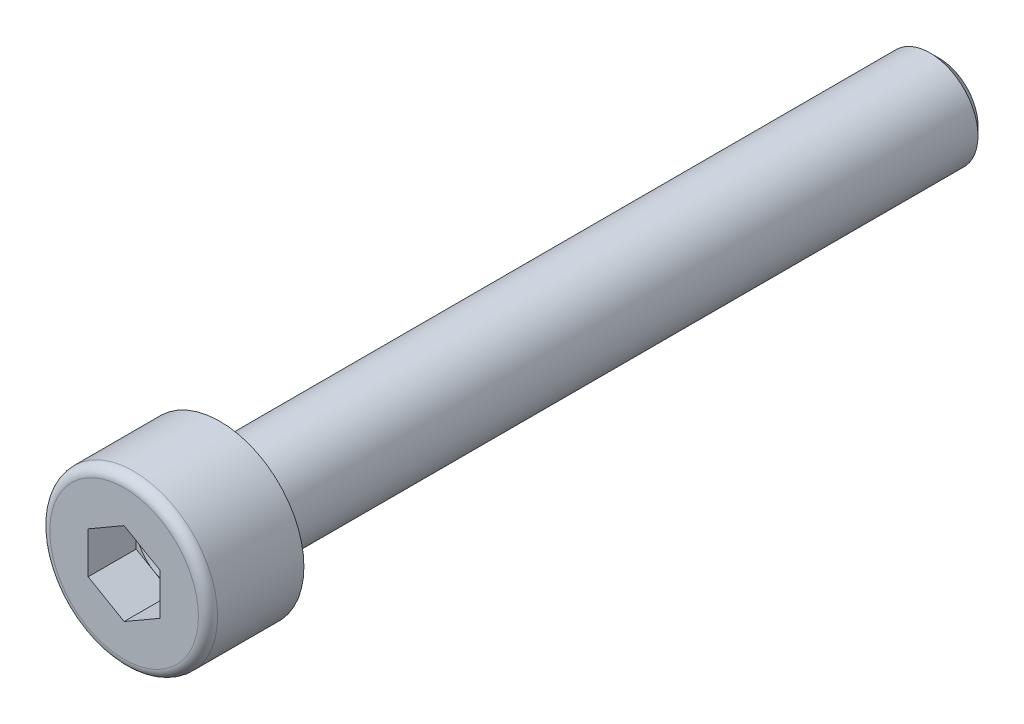
ISO-10303-21;
HEADER;
FILE_DESCRIPTION(('STEP AP214'),'2;1');
FILE_NAME('part.step','',(''),(''),'','','');
FILE_SCHEMA(('AUTOMOTIVE_DESIGN { 1 0 10303 214 1 1 1 1 }'));
ENDSEC;
DATA;
#1=APPLICATION_CONTEXT('core data for automotive mechanical design processes');
#2=APPLICATION_PROTOCOL_DEFINITION('international standard','automotive_design',2000,#1);
#3=PRODUCT_CONTEXT('',#1,'mechanical');
#4=PRODUCT('Part','Part','',(#3));
#5=PRODUCT_RELATED_PRODUCT_CATEGORY('part','',(#4));
#6=PRODUCT_DEFINITION_FORMATION('','',#4);
#7=PRODUCT_DEFINITION_CONTEXT('part definition',#1,'design');
#8=PRODUCT_DEFINITION('design','',#6,#7);
#9=PRODUCT_DEFINITION_SHAPE('','',#8);
#10=(LENGTH_UNIT() NAMED_UNIT(*) SI_UNIT(.MILLI.,.METRE.));
#11=(NAMED_UNIT(*) PLANE_ANGLE_UNIT() SI_UNIT($,.RADIAN.));
#12=(NAMED_UNIT(*) SI_UNIT($,.STERADIAN.) SOLID_ANGLE_UNIT());
#13=UNCERTAINTY_MEASURE_WITH_UNIT(LENGTH_MEASURE(1.E-05),#10,'distance_accuracy_value','');
#14=(GEOMETRIC_REPRESENTATION_CONTEXT(3) GLOBAL_UNCERTAINTY_ASSIGNED_CONTEXT((#13)) GLOBAL_UNIT_ASSIGNED_CONTEXT((#10,
#11,#12)) REPRESENTATION_CONTEXT('',''));
#15=CARTESIAN_POINT('',(0.,0.,0.));
#16=DIRECTION('',(0.,0.,1.));
#17=DIRECTION('',(1.,0.,0.));
#18=AXIS2_PLACEMENT_3D('',#15,#16,#17);
#19=CARTESIAN_POINT('',(0.,0.,-33.6211138875));
#20=DIRECTION('',(0.,0.,1.));
#21=DIRECTION('',(1.,0.,0.));
#22=AXIS2_PLACEMENT_3D('',#19,#20,#21);
#23=CONICAL_SURFACE('',#22,2.,0.785398163397452);
#24=CARTESIAN_POINT('',(0.,0.,-33.6211138875));
#25=DIRECTION('',(0.,0.,1.));
#26=DIRECTION('',(1.,0.,0.));
#27=AXIS2_PLACEMENT_3D('',#24,#25,#26);
#28=CIRCLE('',#27,2.);
#29=CARTESIAN_POINT('',(2.,0.,-33.6211138875));
#30=VERTEX_POINT('',#29);
#31=EDGE_CURVE('E276',#30,#30,#28,.T.);
#32=ORIENTED_EDGE('',*,*,#31,.F.);
#33=EDGE_LOOP('',(#32));
#34=FACE_BOUND('',#33,.T.);
#35=CARTESIAN_POINT('',(0.,0.,-34.));
#36=DIRECTION('',(0.,0.,-1.));
#37=DIRECTION('',(1.,0.,0.));
#38=AXIS2_PLACEMENT_3D('',#35,#36,#37);
#39=CIRCLE('',#38,1.62111388749999);
#40=CARTESIAN_POINT('',(1.62111388749999,0.,-34.));
#41=VERTEX_POINT('',#40);
#42=EDGE_CURVE('E282',#41,#41,#39,.T.);
#43=ORIENTED_EDGE('',*,*,#42,.F.);
#44=EDGE_LOOP('',(#43));
#45=FACE_BOUND('',#44,.T.);
#46=ADVANCED_FACE('F17',(#34,#45),#23,.T.);
#47=CARTESIAN_POINT('',(0.,0.,-4.2));
#48=DIRECTION('',(0.,0.,1.));
#49=DIRECTION('',(1.,0.,0.));
#50=AXIS2_PLACEMENT_3D('',#47,#48,#49);
#51=TOROIDAL_SURFACE('',#50,2.46487406649082,0.2);
#52=CARTESIAN_POINT('',(0.,0.,-4.));
#53=DIRECTION('',(0.,0.,1.));
#54=DIRECTION('',(1.,0.,0.));
#55=AXIS2_PLACEMENT_3D('',#52,#53,#54);
#56=CIRCLE('',#55,2.46487406649082);
#57=CARTESIAN_POINT('',(2.46487406649082,0.,-4.));
#58=VERTEX_POINT('',#57);
#59=EDGE_CURVE('E273',#58,#58,#56,.T.);
#60=ORIENTED_EDGE('',*,*,#59,.F.);
#61=EDGE_LOOP('',(#60));
#62=FACE_BOUND('',#61,.T.);
#63=CARTESIAN_POINT('',(0.,0.,-4.09922579489519));
#64=DIRECTION('',(0.,0.,-1.));
#65=DIRECTION('',(1.,0.,0.));
#66=AXIS2_PLACEMENT_3D('',#63,#64,#65);
#67=CIRCLE('',#66,2.29211828631114);
#68=CARTESIAN_POINT('',(2.29211828631114,0.,-4.09922579489519));
#69=VERTEX_POINT('',#68);
#70=EDGE_CURVE('E11',#69,#69,#67,.T.);
#71=ORIENTED_EDGE('',*,*,#70,.F.);
#72=EDGE_LOOP('',(#71));
#73=FACE_BOUND('',#72,.T.);
#74=ADVANCED_FACE('F615',(#62,#73),#51,.F.);
#75=CARTESIAN_POINT('',(0.,0.,-4.65406982827));
#76=DIRECTION('',(0.,0.,-1.));
#77=DIRECTION('',(-1.,0.,0.));
#78=AXIS2_PLACEMENT_3D('',#75,#76,#77);
#79=TOROIDAL_SURFACE('',#78,2.2,0.2);
#80=CARTESIAN_POINT('',(0.,0.,-4.65406982827));
#81=DIRECTION('',(0.,0.,-1.));
#82=DIRECTION('',(-1.,0.,0.));
#83=AXIS2_PLACEMENT_3D('',#80,#81,#82);
#84=CIRCLE('',#83,2.);
#85=CARTESIAN_POINT('',(-2.,0.,-4.65406982827));
#86=VERTEX_POINT('',#85);
#87=EDGE_CURVE('E279',#86,#86,#84,.T.);
#88=ORIENTED_EDGE('',*,*,#87,.F.);
#89=EDGE_LOOP('',(#88));
#90=FACE_BOUND('',#89,.T.);
#91=CARTESIAN_POINT('',(0.,0.,-4.55329562316518));
#92=DIRECTION('',(0.,0.,1.));
#93=DIRECTION('',(1.,0.,0.));
#94=AXIS2_PLACEMENT_3D('',#91,#92,#93);
#95=CIRCLE('',#94,2.02724421982031);
#96=CARTESIAN_POINT('',(2.02724421982031,0.,-4.55329562316518));
#97=VERTEX_POINT('',#96);
#98=EDGE_CURVE('E25',#97,#97,#95,.T.);
#99=ORIENTED_EDGE('',*,*,#98,.F.);
#100=EDGE_LOOP('',(#99));
#101=FACE_BOUND('',#100,.T.);
#102=ADVANCED_FACE('F606',(#90,#101),#79,.F.);
#103=CARTESIAN_POINT('',(0.,0.,-4.));
#104=DIRECTION('',(0.,0.,1.));
#105=DIRECTION('',(1.,0.,0.));
#106=AXIS2_PLACEMENT_3D('',#103,#104,#105);
#107=CONICAL_SURFACE('',#106,2.35,0.528074448426359);
#108=ORIENTED_EDGE('',*,*,#70,.T.);
#109=EDGE_LOOP('',(#108));
#110=FACE_BOUND('',#109,.T.);
#111=ORIENTED_EDGE('',*,*,#98,.T.);
#112=EDGE_LOOP('',(#111));
#113=FACE_BOUND('',#112,.T.);
#114=ADVANCED_FACE('F597',(#110,#113),#107,.T.);
#115=CARTESIAN_POINT('',(0.,0.,-2.));
#116=DIRECTION('',(0.,0.,1.));
#117=DIRECTION('',(1.,0.,0.));
#118=AXIS2_PLACEMENT_3D('',#115,#116,#117);
#119=CONICAL_SURFACE('',#118,1.5,1.22173047639603);
#120=CARTESIAN_POINT('',(0.,0.,-2.));
#121=DIRECTION('',(0.,0.,-1.));
#122=DIRECTION('',(-1.,0.,0.));
#123=AXIS2_PLACEMENT_3D('',#120,#121,#122);
#124=CIRCLE('',#123,1.5);
#125=CARTESIAN_POINT('',(-1.5,0.,-2.));
#126=VERTEX_POINT('',#125);
#127=CARTESIAN_POINT('',(-0.75,1.29903810567666,-2.));
#128=VERTEX_POINT('',#127);
#129=EDGE_CURVE('E169',#126,#128,#124,.T.);
#130=ORIENTED_EDGE('',*,*,#129,.F.);
#131=CARTESIAN_POINT('',(0.,0.,-2.));
#132=DIRECTION('',(0.,0.,-1.));
#133=DIRECTION('',(-1.,0.,0.));
#134=AXIS2_PLACEMENT_3D('',#131,#132,#133);
#135=CIRCLE('',#134,1.5);
#136=CARTESIAN_POINT('',(-0.75,-1.29903810567666,-2.));
#137=VERTEX_POINT('',#136);
#138=EDGE_CURVE('E147',#137,#126,#135,.T.);
#139=ORIENTED_EDGE('',*,*,#138,.F.);
#140=CARTESIAN_POINT('',(0.,0.,-2.));
#141=DIRECTION('',(0.,0.,-1.));
#142=DIRECTION('',(-1.,0.,0.));
#143=AXIS2_PLACEMENT_3D('',#140,#141,#142);
#144=CIRCLE('',#143,1.5);
#145=CARTESIAN_POINT('',(0.75,-1.29903810567666,-2.));
#146=VERTEX_POINT('',#145);
#147=EDGE_CURVE('E232',#146,#137,#144,.T.);
#148=ORIENTED_EDGE('',*,*,#147,.F.);
#149=CARTESIAN_POINT('',(0.,0.,-2.));
#150=DIRECTION('',(0.,0.,-1.));
#151=DIRECTION('',(-1.,0.,0.));
#152=AXIS2_PLACEMENT_3D('',#149,#150,#151);
#153=CIRCLE('',#152,1.5);
#154=CARTESIAN_POINT('',(1.5,0.,-2.));
#155=VERTEX_POINT('',#154);
#156=EDGE_CURVE('E227',#155,#146,#153,.T.);
#157=ORIENTED_EDGE('',*,*,#156,.F.);
#158=CARTESIAN_POINT('',(0.,0.,-2.));
#159=DIRECTION('',(0.,0.,-1.));
#160=DIRECTION('',(-1.,0.,0.));
#161=AXIS2_PLACEMENT_3D('',#158,#159,#160);
#162=CIRCLE('',#161,1.5);
#163=CARTESIAN_POINT('',(0.75,1.29903810567666,-2.));
#164=VERTEX_POINT('',#163);
#165=EDGE_CURVE('E201',#164,#155,#162,.T.);
#166=ORIENTED_EDGE('',*,*,#165,.F.);
#167=CARTESIAN_POINT('',(0.,0.,-2.));
#168=DIRECTION('',(0.,0.,-1.));
#169=DIRECTION('',(-1.,0.,0.));
#170=AXIS2_PLACEMENT_3D('',#167,#168,#169);
#171=CIRCLE('',#170,1.5);
#172=EDGE_CURVE('E173',#128,#164,#171,.T.);
#173=ORIENTED_EDGE('',*,*,#172,.F.);
#174=EDGE_LOOP('',(#130,#139,#148,#157,#166,#173));
#175=FACE_BOUND('',#174,.T.);
#176=CARTESIAN_POINT('',(0.,0.,-2.5459553513993));
#177=VERTEX_POINT('',#176);
#178=VERTEX_LOOP('',#177);
#179=FACE_BOUND('',#178,.T.);
#180=ADVANCED_FACE('F170',(#175,#179),#119,.F.);
#181=CARTESIAN_POINT('',(0.,0.,-2.));
#182=DIRECTION('',(0.,0.,1.));
#183=DIRECTION('',(1.,0.,0.));
#184=AXIS2_PLACEMENT_3D('',#181,#182,#183);
#185=PLANE('',#184);
#186=DIRECTION('',(-0.866025403784439,0.5,0.));
#187=VECTOR('',#186,1.);
#188=CARTESIAN_POINT('',(-0.75,-1.29903810567666,-2.));
#189=LINE('',#188,#187);
#190=CARTESIAN_POINT('',(-1.5,-0.866025403784439,-2.));
#191=VERTEX_POINT('',#190);
#192=EDGE_CURVE('E152',#137,#191,#189,.T.);
#193=ORIENTED_EDGE('',*,*,#192,.F.);
#194=ORIENTED_EDGE('',*,*,#138,.T.);
#195=DIRECTION('',(0.,1.,0.));
#196=VECTOR('',#195,1.);
#197=CARTESIAN_POINT('',(-1.5,0.,-2.));
#198=LINE('',#197,#196);
#199=EDGE_CURVE('E150',#191,#126,#198,.T.);
#200=ORIENTED_EDGE('',*,*,#199,.F.);
#201=EDGE_LOOP('',(#193,#194,#200));
#202=FACE_BOUND('',#201,.T.);
#203=ADVANCED_FACE('F149',(#202),#185,.T.);
#204=CARTESIAN_POINT('',(0.721250214161918,-1.31563680226942,-2.));
#205=DIRECTION('',(-0.5,0.866025403784439,0.));
#206=DIRECTION('',(0.,0.,1.));
#207=AXIS2_PLACEMENT_3D('',#204,#205,#206);
#208=PLANE('',#207);
#209=DIRECTION('',(-0.866025403784439,-0.5,0.));
#210=VECTOR('',#209,1.);
#211=CARTESIAN_POINT('',(0.721250214161918,-1.31563680226942,0.));
#212=LINE('',#211,#210);
#213=CARTESIAN_POINT('',(1.5,-0.866025403784439,0.));
#214=VERTEX_POINT('',#213);
#215=CARTESIAN_POINT('',(0.,-1.73205080756888,0.));
#216=VERTEX_POINT('',#215);
#217=EDGE_CURVE('E216',#214,#216,#212,.T.);
#218=ORIENTED_EDGE('',*,*,#217,.F.);
#219=DIRECTION('',(0.,0.,1.));
#220=VECTOR('',#219,1.);
#221=CARTESIAN_POINT('',(1.5,-0.866025403784439,-2.));
#222=LINE('',#221,#220);
#223=CARTESIAN_POINT('',(1.5,-0.866025403784439,-2.));
#224=VERTEX_POINT('',#223);
#225=EDGE_CURVE('E195',#224,#214,#222,.T.);
#226=ORIENTED_EDGE('',*,*,#225,.F.);
#227=DIRECTION('',(-0.866025403784439,-0.5,0.));
#228=VECTOR('',#227,1.);
#229=CARTESIAN_POINT('',(0.721250214161918,-1.31563680226942,-2.));
#230=LINE('',#229,#228);
#231=EDGE_CURVE('E231',#224,#146,#230,.T.);
#232=ORIENTED_EDGE('',*,*,#231,.T.);
#233=DIRECTION('',(-0.866025403784439,-0.5,0.));
#234=VECTOR('',#233,1.);
#235=CARTESIAN_POINT('',(0.721250214161918,-1.31563680226942,-2.));
#236=LINE('',#235,#234);
#237=CARTESIAN_POINT('',(0.,-1.73205080756888,-2.));
#238=VERTEX_POINT('',#237);
#239=EDGE_CURVE('E237',#146,#238,#236,.T.);
#240=ORIENTED_EDGE('',*,*,#239,.T.);
#241=DIRECTION('',(0.,0.,1.));
#242=VECTOR('',#241,1.);
#243=CARTESIAN_POINT('',(0.,-1.73205080756888,-2.));
#244=LINE('',#243,#242);
#245=EDGE_CURVE('E166',#238,#216,#244,.T.);
#246=ORIENTED_EDGE('',*,*,#245,.T.);
#247=EDGE_LOOP('',(#218,#226,#232,#240,#246));
#248=FACE_BOUND('',#247,.T.);
#249=ADVANCED_FACE('F572',(#248),#208,.T.);
#250=CARTESIAN_POINT('',(-0.75,-1.29903810567666,-2.));
#251=DIRECTION('',(0.5,0.866025403784439,0.));
#252=DIRECTION('',(0.,0.,-1.));
#253=AXIS2_PLACEMENT_3D('',#250,#251,#252);
#254=PLANE('',#253);
#255=DIRECTION('',(-0.866025403784439,0.5,0.));
#256=VECTOR('',#255,1.);
#257=CARTESIAN_POINT('',(-0.75,-1.29903810567666,0.));
#258=LINE('',#257,#256);
#259=CARTESIAN_POINT('',(-1.5,-0.866025403784439,0.));
#260=VERTEX_POINT('',#259);
#261=EDGE_CURVE('E244',#216,#260,#258,.T.);
#262=ORIENTED_EDGE('',*,*,#261,.F.);
#263=ORIENTED_EDGE('',*,*,#245,.F.);
#264=DIRECTION('',(-0.866025403784439,0.5,0.));
#265=VECTOR('',#264,1.);
#266=CARTESIAN_POINT('',(-0.75,-1.29903810567666,-2.));
#267=LINE('',#266,#265);
#268=EDGE_CURVE('E236',#238,#137,#267,.T.);
#269=ORIENTED_EDGE('',*,*,#268,.T.);
#270=ORIENTED_EDGE('',*,*,#192,.T.);
#271=DIRECTION('',(0.,0.,1.));
#272=VECTOR('',#271,1.);
#273=CARTESIAN_POINT('',(-1.5,-0.866025403784439,-2.));
#274=LINE('',#273,#272);
#275=EDGE_CURVE('E164',#191,#260,#274,.T.);
#276=ORIENTED_EDGE('',*,*,#275,.T.);
#277=EDGE_LOOP('',(#262,#263,#269,#270,#276));
#278=FACE_BOUND('',#277,.T.);
#279=ADVANCED_FACE('F563',(#278),#254,.T.);
#280=CARTESIAN_POINT('',(-1.5,0.,-2.));
#281=DIRECTION('',(1.,0.,0.));
#282=DIRECTION('',(0.,-1.,0.));
#283=AXIS2_PLACEMENT_3D('',#280,#281,#282);
#284=PLANE('',#283);
#285=DIRECTION('',(0.,1.,0.));
#286=VECTOR('',#285,1.);
#287=CARTESIAN_POINT('',(-1.5,0.,0.));
#288=LINE('',#287,#286);
#289=CARTESIAN_POINT('',(-1.5,0.866025403784439,0.));
#290=VERTEX_POINT('',#289);
#291=EDGE_CURVE('E248',#260,#290,#288,.T.);
#292=ORIENTED_EDGE('',*,*,#291,.F.);
#293=ORIENTED_EDGE('',*,*,#275,.F.);
#294=ORIENTED_EDGE('',*,*,#199,.T.);
#295=DIRECTION('',(0.,1.,0.));
#296=VECTOR('',#295,1.);
#297=CARTESIAN_POINT('',(-1.5,0.,-2.));
#298=LINE('',#297,#296);
#299=CARTESIAN_POINT('',(-1.5,0.866025403784439,-2.));
#300=VERTEX_POINT('',#299);
#301=EDGE_CURVE('E163',#126,#300,#298,.T.);
#302=ORIENTED_EDGE('',*,*,#301,.T.);
#303=DIRECTION('',(0.,0.,1.));
#304=VECTOR('',#303,1.);
#305=CARTESIAN_POINT('',(-1.5,0.866025403784439,-2.));
#306=LINE('',#305,#304);
#307=EDGE_CURVE('E194',#300,#290,#306,.T.);
#308=ORIENTED_EDGE('',*,*,#307,.T.);
#309=EDGE_LOOP('',(#292,#293,#294,#302,#308));
#310=FACE_BOUND('',#309,.T.);
#311=ADVANCED_FACE('F161',(#310),#284,.T.);
#312=CARTESIAN_POINT('',(-0.742562637900043,1.30333206868713,-2.));
#313=DIRECTION('',(0.5,-0.866025403784439,0.));
#314=DIRECTION('',(0.,0.,-1.));
#315=AXIS2_PLACEMENT_3D('',#312,#313,#314);
#316=PLANE('',#315);
#317=DIRECTION('',(0.866025403784439,0.5,0.));
#318=VECTOR('',#317,1.);
#319=CARTESIAN_POINT('',(-0.742562637900043,1.30333206868713,0.));
#320=LINE('',#319,#318);
#321=CARTESIAN_POINT('',(0.,1.73205080756888,0.));
#322=VERTEX_POINT('',#321);
#323=EDGE_CURVE('E259',#290,#322,#320,.T.);
#324=ORIENTED_EDGE('',*,*,#323,.F.);
#325=ORIENTED_EDGE('',*,*,#307,.F.);
#326=DIRECTION('',(0.866025403784439,0.5,0.));
#327=VECTOR('',#326,1.);
#328=CARTESIAN_POINT('',(-0.742562637900043,1.30333206868713,-2.));
#329=LINE('',#328,#327);
#330=EDGE_CURVE('E178',#300,#128,#329,.T.);
#331=ORIENTED_EDGE('',*,*,#330,.T.);
#332=DIRECTION('',(0.866025403784439,0.5,0.));
#333=VECTOR('',#332,1.);
#334=CARTESIAN_POINT('',(-0.742562637900043,1.30333206868713,-2.));
#335=LINE('',#334,#333);
#336=CARTESIAN_POINT('',(0.,1.73205080756888,-2.));
#337=VERTEX_POINT('',#336);
#338=EDGE_CURVE('E190',#128,#337,#335,.T.);
#339=ORIENTED_EDGE('',*,*,#338,.T.);
#340=DIRECTION('',(0.,0.,1.));
#341=VECTOR('',#340,1.);
#342=CARTESIAN_POINT('',(0.,1.73205080756888,-2.));
#343=LINE('',#342,#341);
#344=EDGE_CURVE('E191',#337,#322,#343,.T.);
#345=ORIENTED_EDGE('',*,*,#344,.T.);
#346=EDGE_LOOP('',(#324,#325,#331,#339,#345));
#347=FACE_BOUND('',#346,.T.);
#348=ADVANCED_FACE('F545',(#347),#316,.T.);
#349=CARTESIAN_POINT('',(0.75,1.29903810567666,-2.));
#350=DIRECTION('',(-0.5,-0.866025403784439,0.));
#351=DIRECTION('',(-0.866025403784439,0.5,0.));
#352=AXIS2_PLACEMENT_3D('',#349,#350,#351);
#353=PLANE('',#352);
#354=DIRECTION('',(0.866025403784439,-0.5,0.));
#355=VECTOR('',#354,1.);
#356=CARTESIAN_POINT('',(0.75,1.29903810567666,0.));
#357=LINE('',#356,#355);
#358=CARTESIAN_POINT('',(1.5,0.866025403784439,0.));
#359=VERTEX_POINT('',#358);
#360=EDGE_CURVE('E263',#322,#359,#357,.T.);
#361=ORIENTED_EDGE('',*,*,#360,.F.);
#362=ORIENTED_EDGE('',*,*,#344,.F.);
#363=DIRECTION('',(0.866025403784439,-0.5,0.));
#364=VECTOR('',#363,1.);
#365=CARTESIAN_POINT('',(0.75,1.29903810567666,-2.));
#366=LINE('',#365,#364);
#367=EDGE_CURVE('E207',#337,#164,#366,.T.);
#368=ORIENTED_EDGE('',*,*,#367,.T.);
#369=DIRECTION('',(0.866025403784439,-0.5,0.));
#370=VECTOR('',#369,1.);
#371=CARTESIAN_POINT('',(0.75,1.29903810567666,-2.));
#372=LINE('',#371,#370);
#373=CARTESIAN_POINT('',(1.5,0.866025403784439,-2.));
#374=VERTEX_POINT('',#373);
#375=EDGE_CURVE('E211',#164,#374,#372,.T.);
#376=ORIENTED_EDGE('',*,*,#375,.T.);
#377=DIRECTION('',(0.,0.,1.));
#378=VECTOR('',#377,1.);
#379=CARTESIAN_POINT('',(1.5,0.866025403784439,-2.));
#380=LINE('',#379,#378);
#381=EDGE_CURVE('E285',#374,#359,#380,.T.);
#382=ORIENTED_EDGE('',*,*,#381,.T.);
#383=EDGE_LOOP('',(#361,#362,#368,#376,#382));
#384=FACE_BOUND('',#383,.T.);
#385=ADVANCED_FACE('F536',(#384),#353,.T.);
#386=CARTESIAN_POINT('',(1.5,0.,-2.));
#387=DIRECTION('',(-1.,0.,0.));
#388=DIRECTION('',(0.,0.,1.));
#389=AXIS2_PLACEMENT_3D('',#386,#387,#388);
#390=PLANE('',#389);
#391=DIRECTION('',(0.,-1.,0.));
#392=VECTOR('',#391,1.);
#393=CARTESIAN_POINT('',(1.5,0.,0.));
#394=LINE('',#393,#392);
#395=EDGE_CURVE('E212',#359,#214,#394,.T.);
#396=ORIENTED_EDGE('',*,*,#395,.F.);
#397=ORIENTED_EDGE('',*,*,#381,.F.);
#398=DIRECTION('',(0.,-1.,0.));
#399=VECTOR('',#398,1.);
#400=CARTESIAN_POINT('',(1.5,0.,-2.));
#401=LINE('',#400,#399);
#402=EDGE_CURVE('E196',#374,#155,#401,.T.);
#403=ORIENTED_EDGE('',*,*,#402,.T.);
#404=DIRECTION('',(0.,-1.,0.));
#405=VECTOR('',#404,1.);
#406=CARTESIAN_POINT('',(1.5,0.,-2.));
#407=LINE('',#406,#405);
#408=EDGE_CURVE('E200',#155,#224,#407,.T.);
#409=ORIENTED_EDGE('',*,*,#408,.T.);
#410=ORIENTED_EDGE('',*,*,#225,.T.);
#411=EDGE_LOOP('',(#396,#397,#403,#409,#410));
#412=FACE_BOUND('',#411,.T.);
#413=ADVANCED_FACE('F526',(#412),#390,.T.);
#414=CARTESIAN_POINT('',(-0.50884052066219,0.,-34.));
#415=DIRECTION('',(0.,0.,1.));
#416=DIRECTION('',(1.,0.,0.));
#417=AXIS2_PLACEMENT_3D('',#414,#415,#416);
#418=PLANE('',#417);
#419=ORIENTED_EDGE('',*,*,#42,.T.);
#420=EDGE_LOOP('',(#419));
#421=FACE_BOUND('',#420,.T.);
#422=ADVANCED_FACE('F517',(#421),#418,.F.);
#423=CARTESIAN_POINT('',(0.,0.,-17.));
#424=DIRECTION('',(0.,0.,1.));
#425=DIRECTION('',(1.,0.,0.));
#426=AXIS2_PLACEMENT_3D('',#423,#424,#425);
#427=CYLINDRICAL_SURFACE('',#426,2.);
#428=ORIENTED_EDGE('',*,*,#87,.T.);
#429=EDGE_LOOP('',(#428));
#430=FACE_BOUND('',#429,.T.);
#431=ORIENTED_EDGE('',*,*,#31,.T.);
#432=EDGE_LOOP('',(#431));
#433=FACE_BOUND('',#432,.T.);
#434=ADVANCED_FACE('F507',(#430,#433),#427,.T.);
#435=CARTESIAN_POINT('',(-1.61056634651914,0.,-4.));
#436=DIRECTION('',(0.,0.,1.));
#437=DIRECTION('',(1.,0.,0.));
#438=AXIS2_PLACEMENT_3D('',#435,#436,#437);
#439=PLANE('',#438);
#440=CARTESIAN_POINT('',(0.,0.,-4.));
#441=DIRECTION('',(0.,0.,1.));
#442=DIRECTION('',(1.,0.,0.));
#443=AXIS2_PLACEMENT_3D('',#440,#441,#442);
#444=CIRCLE('',#443,3.5);
#445=CARTESIAN_POINT('',(3.5,0.,-4.));
#446=VERTEX_POINT('',#445);
#447=EDGE_CURVE('E270',#446,#446,#444,.T.);
#448=ORIENTED_EDGE('',*,*,#447,.F.);
#449=EDGE_LOOP('',(#448));
#450=FACE_BOUND('',#449,.T.);
#451=ORIENTED_EDGE('',*,*,#59,.T.);
#452=EDGE_LOOP('',(#451));
#453=FACE_BOUND('',#452,.T.);
#454=ADVANCED_FACE('F498',(#450,#453),#439,.F.);
#455=CARTESIAN_POINT('',(0.,0.,-17.));
#456=DIRECTION('',(0.,0.,1.));
#457=DIRECTION('',(1.,0.,0.));
#458=AXIS2_PLACEMENT_3D('',#455,#456,#457);
#459=CYLINDRICAL_SURFACE('',#458,3.5);
#460=ORIENTED_EDGE('',*,*,#447,.T.);
#461=EDGE_LOOP('',(#460));
#462=FACE_BOUND('',#461,.T.);
#463=CARTESIAN_POINT('',(0.,0.,-0.4));
#464=DIRECTION('',(0.,0.,1.));
#465=DIRECTION('',(1.,0.,0.));
#466=AXIS2_PLACEMENT_3D('',#463,#464,#465);
#467=CIRCLE('',#466,3.5);
#468=CARTESIAN_POINT('',(3.5,0.,-0.4));
#469=VERTEX_POINT('',#468);
#470=EDGE_CURVE('E267',#469,#469,#467,.T.);
#471=ORIENTED_EDGE('',*,*,#470,.F.);
#472=EDGE_LOOP('',(#471));
#473=FACE_BOUND('',#472,.T.);
#474=ADVANCED_FACE('F488',(#462,#473),#459,.T.);
#475=CARTESIAN_POINT('',(0.,0.,-0.4));
#476=DIRECTION('',(0.,0.,1.));
#477=DIRECTION('',(1.,0.,0.));
#478=AXIS2_PLACEMENT_3D('',#475,#476,#477);
#479=TOROIDAL_SURFACE('',#478,3.1,0.4);
#480=CARTESIAN_POINT('',(0.,0.,0.));
#481=DIRECTION('',(0.,0.,1.));
#482=DIRECTION('',(1.,0.,0.));
#483=AXIS2_PLACEMENT_3D('',#480,#481,#482);
#484=CIRCLE('',#483,3.1);
#485=CARTESIAN_POINT('',(3.1,0.,0.));
#486=VERTEX_POINT('',#485);
#487=EDGE_CURVE('E217',#486,#486,#484,.T.);
#488=ORIENTED_EDGE('',*,*,#487,.F.);
#489=EDGE_LOOP('',(#488));
#490=FACE_BOUND('',#489,.T.);
#491=ORIENTED_EDGE('',*,*,#470,.T.);
#492=EDGE_LOOP('',(#491));
#493=FACE_BOUND('',#492,.T.);
#494=ADVANCED_FACE('F478',(#490,#493),#479,.T.);
#495=CARTESIAN_POINT('',(-1.10172582585694,0.,0.));
#496=DIRECTION('',(0.,0.,-1.));
#497=DIRECTION('',(0.,-1.,0.));
#498=AXIS2_PLACEMENT_3D('',#495,#496,#497);
#499=PLANE('',#498);
#500=ORIENTED_EDGE('',*,*,#395,.T.);
#501=ORIENTED_EDGE('',*,*,#217,.T.);
#502=ORIENTED_EDGE('',*,*,#261,.T.);
#503=ORIENTED_EDGE('',*,*,#291,.T.);
#504=ORIENTED_EDGE('',*,*,#323,.T.);
#505=ORIENTED_EDGE('',*,*,#360,.T.);
#506=EDGE_LOOP('',(#500,#501,#502,#503,#504,#505));
#507=FACE_BOUND('',#506,.T.);
#508=ORIENTED_EDGE('',*,*,#487,.T.);
#509=EDGE_LOOP('',(#508));
#510=FACE_BOUND('',#509,.T.);
#511=ADVANCED_FACE('F467',(#507,#510),#499,.F.);
#512=CARTESIAN_POINT('',(0.,0.,-2.));
#513=DIRECTION('',(0.,0.,1.));
#514=DIRECTION('',(1.,0.,0.));
#515=AXIS2_PLACEMENT_3D('',#512,#513,#514);
#516=PLANE('',#515);
#517=ORIENTED_EDGE('',*,*,#239,.F.);
#518=ORIENTED_EDGE('',*,*,#147,.T.);
#519=ORIENTED_EDGE('',*,*,#268,.F.);
#520=EDGE_LOOP('',(#517,#518,#519));
#521=FACE_BOUND('',#520,.T.);
#522=ADVANCED_FACE('F456',(#521),#516,.T.);
#523=CARTESIAN_POINT('',(0.,0.,-2.));
#524=DIRECTION('',(0.,0.,1.));
#525=DIRECTION('',(1.,0.,0.));
#526=AXIS2_PLACEMENT_3D('',#523,#524,#525);
#527=PLANE('',#526);
#528=ORIENTED_EDGE('',*,*,#408,.F.);
#529=ORIENTED_EDGE('',*,*,#156,.T.);
#530=ORIENTED_EDGE('',*,*,#231,.F.);
#531=EDGE_LOOP('',(#528,#529,#530));
#532=FACE_BOUND('',#531,.T.);
#533=ADVANCED_FACE('F445',(#532),#527,.T.);
#534=CARTESIAN_POINT('',(0.,0.,-2.));
#535=DIRECTION('',(0.,0.,1.));
#536=DIRECTION('',(1.,0.,0.));
#537=AXIS2_PLACEMENT_3D('',#534,#535,#536);
#538=PLANE('',#537);
#539=ORIENTED_EDGE('',*,*,#375,.F.);
#540=ORIENTED_EDGE('',*,*,#165,.T.);
#541=ORIENTED_EDGE('',*,*,#402,.F.);
#542=EDGE_LOOP('',(#539,#540,#541));
#543=FACE_BOUND('',#542,.T.);
#544=ADVANCED_FACE('F434',(#543),#538,.T.);
#545=CARTESIAN_POINT('',(0.,0.,-2.));
#546=DIRECTION('',(0.,0.,1.));
#547=DIRECTION('',(1.,0.,0.));
#548=AXIS2_PLACEMENT_3D('',#545,#546,#547);
#549=PLANE('',#548);
#550=ORIENTED_EDGE('',*,*,#338,.F.);
#551=ORIENTED_EDGE('',*,*,#172,.T.);
#552=ORIENTED_EDGE('',*,*,#367,.F.);
#553=EDGE_LOOP('',(#550,#551,#552));
#554=FACE_BOUND('',#553,.T.);
#555=ADVANCED_FACE('F423',(#554),#549,.T.);
#556=CARTESIAN_POINT('',(0.,0.,-2.));
#557=DIRECTION('',(0.,0.,1.));
#558=DIRECTION('',(1.,0.,0.));
#559=AXIS2_PLACEMENT_3D('',#556,#557,#558);
#560=PLANE('',#559);
#561=ORIENTED_EDGE('',*,*,#301,.F.);
#562=ORIENTED_EDGE('',*,*,#129,.T.);
#563=ORIENTED_EDGE('',*,*,#330,.F.);
#564=EDGE_LOOP('',(#561,#562,#563));
#565=FACE_BOUND('',#564,.T.);
#566=ADVANCED_FACE('F180',(#565),#560,.T.);
#567=CLOSED_SHELL('',(#46,#74,#102,#114,#180,#203,#249,#279,#311,#348,#385,#413,#422,#434,#454,
#474,#494,#511,#522,#533,#544,#555,#566));
#568=MANIFOLD_SOLID_BREP('B1',#567);
#569=ADVANCED_BREP_SHAPE_REPRESENTATION('',(#18,#568),#14);
#570=SHAPE_DEFINITION_REPRESENTATION(#9,#569);
ENDSEC;
END-ISO-10303-21;
